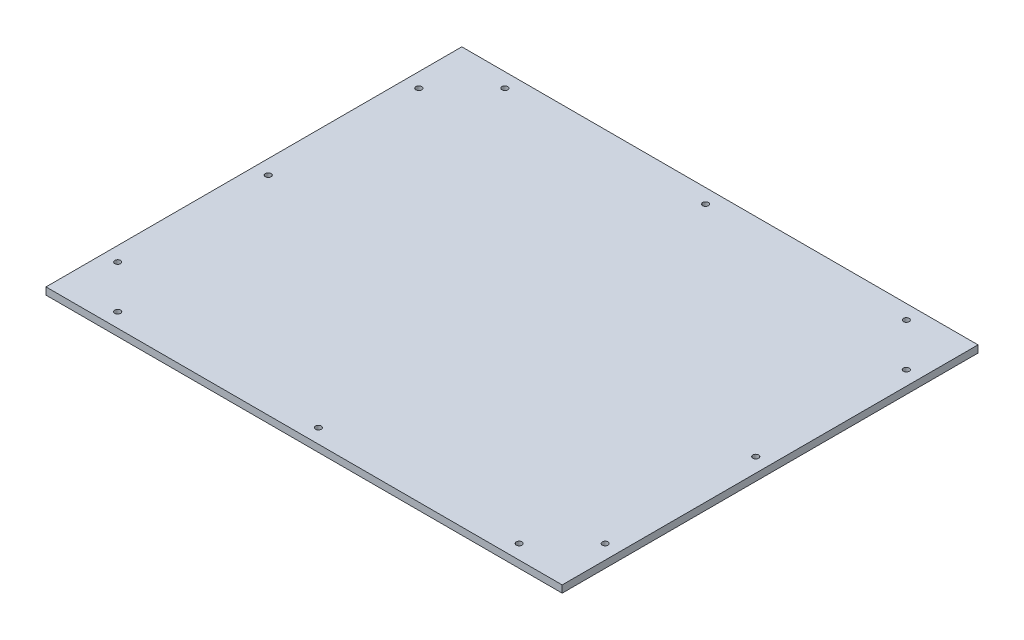
ISO-10303-21;
HEADER;
FILE_DESCRIPTION(('STEP AP214'),'2;1');
FILE_NAME('part.step','',(''),(''),'','','');
FILE_SCHEMA(('AUTOMOTIVE_DESIGN { 1 0 10303 214 1 1 1 1 }'));
ENDSEC;
DATA;
#1=APPLICATION_CONTEXT('core data for automotive mechanical design processes');
#2=APPLICATION_PROTOCOL_DEFINITION('international standard','automotive_design',2000,#1);
#3=PRODUCT_CONTEXT('',#1,'mechanical');
#4=PRODUCT('Part','Part','',(#3));
#5=PRODUCT_RELATED_PRODUCT_CATEGORY('part','',(#4));
#6=PRODUCT_DEFINITION_FORMATION('','',#4);
#7=PRODUCT_DEFINITION_CONTEXT('part definition',#1,'design');
#8=PRODUCT_DEFINITION('design','',#6,#7);
#9=PRODUCT_DEFINITION_SHAPE('','',#8);
#10=(LENGTH_UNIT() NAMED_UNIT(*) SI_UNIT(.MILLI.,.METRE.));
#11=(NAMED_UNIT(*) PLANE_ANGLE_UNIT() SI_UNIT($,.RADIAN.));
#12=(NAMED_UNIT(*) SI_UNIT($,.STERADIAN.) SOLID_ANGLE_UNIT());
#13=UNCERTAINTY_MEASURE_WITH_UNIT(LENGTH_MEASURE(1.E-05),#10,'distance_accuracy_value','');
#14=(GEOMETRIC_REPRESENTATION_CONTEXT(3) GLOBAL_UNCERTAINTY_ASSIGNED_CONTEXT((#13)) GLOBAL_UNIT_ASSIGNED_CONTEXT((#10,
#11,#12)) REPRESENTATION_CONTEXT('',''));
#15=CARTESIAN_POINT('',(0.,0.,0.));
#16=DIRECTION('',(0.,0.,1.));
#17=DIRECTION('',(1.,0.,0.));
#18=AXIS2_PLACEMENT_3D('',#15,#16,#17);
#19=CARTESIAN_POINT('',(0.,6.35,0.));
#20=DIRECTION('',(0.,-1.,0.));
#21=DIRECTION('',(0.,0.,-1.));
#22=AXIS2_PLACEMENT_3D('',#19,#20,#21);
#23=PLANE('',#22);
#24=DIRECTION('',(0.,0.,1.));
#25=VECTOR('',#24,1.);
#26=CARTESIAN_POINT('',(0.,6.35,0.));
#27=LINE('',#26,#25);
#28=CARTESIAN_POINT('',(0.,6.35,-368.3));
#29=VERTEX_POINT('',#28);
#30=CARTESIAN_POINT('',(0.,6.35,0.));
#31=VERTEX_POINT('',#30);
#32=EDGE_CURVE('E87',#29,#31,#27,.T.);
#33=ORIENTED_EDGE('',*,*,#32,.T.);
#34=DIRECTION('',(1.,0.,0.));
#35=VECTOR('',#34,1.);
#36=CARTESIAN_POINT('',(0.,6.35,0.));
#37=LINE('',#36,#35);
#38=CARTESIAN_POINT('',(457.2,6.35,0.));
#39=VERTEX_POINT('',#38);
#40=EDGE_CURVE('E82',#31,#39,#37,.T.);
#41=ORIENTED_EDGE('',*,*,#40,.T.);
#42=DIRECTION('',(0.,0.,-1.));
#43=VECTOR('',#42,1.);
#44=CARTESIAN_POINT('',(457.2,6.35,0.));
#45=LINE('',#44,#43);
#46=CARTESIAN_POINT('',(457.2,6.35,-368.3));
#47=VERTEX_POINT('',#46);
#48=EDGE_CURVE('E85',#39,#47,#45,.T.);
#49=ORIENTED_EDGE('',*,*,#48,.T.);
#50=DIRECTION('',(-1.,0.,0.));
#51=VECTOR('',#50,1.);
#52=CARTESIAN_POINT('',(0.,6.35,-368.3));
#53=LINE('',#52,#51);
#54=EDGE_CURVE('E52',#47,#29,#53,.T.);
#55=ORIENTED_EDGE('',*,*,#54,.T.);
#56=EDGE_LOOP('',(#33,#41,#49,#55));
#57=FACE_BOUND('',#56,.T.);
#58=CARTESIAN_POINT('',(50.8,6.35,-355.6));
#59=DIRECTION('',(0.,1.,0.));
#60=DIRECTION('',(0.,0.,1.));
#61=AXIS2_PLACEMENT_3D('',#58,#59,#60);
#62=CIRCLE('',#61,2.55269999999998);
#63=CARTESIAN_POINT('',(50.8,6.35,-353.0473));
#64=VERTEX_POINT('',#63);
#65=EDGE_CURVE('E102',#64,#64,#62,.T.);
#66=ORIENTED_EDGE('',*,*,#65,.F.);
#67=EDGE_LOOP('',(#66));
#68=FACE_BOUND('',#67,.T.);
#69=CARTESIAN_POINT('',(406.4,6.35,-355.6));
#70=DIRECTION('',(0.,1.,0.));
#71=DIRECTION('',(0.,0.,1.));
#72=AXIS2_PLACEMENT_3D('',#69,#70,#71);
#73=CIRCLE('',#72,2.55270000000003);
#74=CARTESIAN_POINT('',(406.4,6.35,-353.0473));
#75=VERTEX_POINT('',#74);
#76=EDGE_CURVE('E117',#75,#75,#73,.T.);
#77=ORIENTED_EDGE('',*,*,#76,.F.);
#78=EDGE_LOOP('',(#77));
#79=FACE_BOUND('',#78,.T.);
#80=CARTESIAN_POINT('',(228.6,6.35,-12.7));
#81=DIRECTION('',(0.,1.,0.));
#82=DIRECTION('',(0.,0.,1.));
#83=AXIS2_PLACEMENT_3D('',#80,#81,#82);
#84=CIRCLE('',#83,2.55269999999998);
#85=CARTESIAN_POINT('',(228.6,6.35,-10.1473));
#86=VERTEX_POINT('',#85);
#87=EDGE_CURVE('E123',#86,#86,#84,.T.);
#88=ORIENTED_EDGE('',*,*,#87,.F.);
#89=EDGE_LOOP('',(#88));
#90=FACE_BOUND('',#89,.T.);
#91=CARTESIAN_POINT('',(228.6,6.35,-355.6));
#92=DIRECTION('',(0.,1.,0.));
#93=DIRECTION('',(0.,0.,1.));
#94=AXIS2_PLACEMENT_3D('',#91,#92,#93);
#95=CIRCLE('',#94,2.55269999999998);
#96=CARTESIAN_POINT('',(228.6,6.35,-353.0473));
#97=VERTEX_POINT('',#96);
#98=EDGE_CURVE('E129',#97,#97,#95,.T.);
#99=ORIENTED_EDGE('',*,*,#98,.F.);
#100=EDGE_LOOP('',(#99));
#101=FACE_BOUND('',#100,.T.);
#102=CARTESIAN_POINT('',(12.7,6.35,-184.15));
#103=DIRECTION('',(0.,1.,0.));
#104=DIRECTION('',(0.,0.,1.));
#105=AXIS2_PLACEMENT_3D('',#102,#103,#104);
#106=CIRCLE('',#105,2.5527);
#107=CARTESIAN_POINT('',(12.7,6.35,-181.5973));
#108=VERTEX_POINT('',#107);
#109=EDGE_CURVE('E135',#108,#108,#106,.T.);
#110=ORIENTED_EDGE('',*,*,#109,.F.);
#111=EDGE_LOOP('',(#110));
#112=FACE_BOUND('',#111,.T.);
#113=CARTESIAN_POINT('',(444.5,6.35,-184.15));
#114=DIRECTION('',(0.,1.,0.));
#115=DIRECTION('',(0.,0.,1.));
#116=AXIS2_PLACEMENT_3D('',#113,#114,#115);
#117=CIRCLE('',#116,2.55270000000004);
#118=CARTESIAN_POINT('',(444.5,6.35,-181.5973));
#119=VERTEX_POINT('',#118);
#120=EDGE_CURVE('E141',#119,#119,#117,.T.);
#121=ORIENTED_EDGE('',*,*,#120,.F.);
#122=EDGE_LOOP('',(#121));
#123=FACE_BOUND('',#122,.T.);
#124=CARTESIAN_POINT('',(406.4,6.35,-12.7));
#125=DIRECTION('',(0.,1.,0.));
#126=DIRECTION('',(0.,0.,1.));
#127=AXIS2_PLACEMENT_3D('',#124,#125,#126);
#128=CIRCLE('',#127,2.55270000000004);
#129=CARTESIAN_POINT('',(406.4,6.35,-10.1472999999999));
#130=VERTEX_POINT('',#129);
#131=EDGE_CURVE('E147',#130,#130,#128,.T.);
#132=ORIENTED_EDGE('',*,*,#131,.F.);
#133=EDGE_LOOP('',(#132));
#134=FACE_BOUND('',#133,.T.);
#135=CARTESIAN_POINT('',(50.8,6.35,-12.7));
#136=DIRECTION('',(0.,1.,0.));
#137=DIRECTION('',(0.,0.,1.));
#138=AXIS2_PLACEMENT_3D('',#135,#136,#137);
#139=CIRCLE('',#138,2.5527);
#140=CARTESIAN_POINT('',(50.8,6.35,-10.1473));
#141=VERTEX_POINT('',#140);
#142=EDGE_CURVE('E153',#141,#141,#139,.T.);
#143=ORIENTED_EDGE('',*,*,#142,.F.);
#144=EDGE_LOOP('',(#143));
#145=FACE_BOUND('',#144,.T.);
#146=CARTESIAN_POINT('',(12.7,6.35,-50.8));
#147=DIRECTION('',(0.,1.,0.));
#148=DIRECTION('',(0.,0.,1.));
#149=AXIS2_PLACEMENT_3D('',#146,#147,#148);
#150=CIRCLE('',#149,2.5527);
#151=CARTESIAN_POINT('',(12.7,6.35,-48.2473));
#152=VERTEX_POINT('',#151);
#153=EDGE_CURVE('E159',#152,#152,#150,.T.);
#154=ORIENTED_EDGE('',*,*,#153,.F.);
#155=EDGE_LOOP('',(#154));
#156=FACE_BOUND('',#155,.T.);
#157=CARTESIAN_POINT('',(444.5,6.35,-50.8));
#158=DIRECTION('',(0.,1.,0.));
#159=DIRECTION('',(0.,0.,1.));
#160=AXIS2_PLACEMENT_3D('',#157,#158,#159);
#161=CIRCLE('',#160,2.55270000000004);
#162=CARTESIAN_POINT('',(444.5,6.35,-48.2473));
#163=VERTEX_POINT('',#162);
#164=EDGE_CURVE('E165',#163,#163,#161,.T.);
#165=ORIENTED_EDGE('',*,*,#164,.F.);
#166=EDGE_LOOP('',(#165));
#167=FACE_BOUND('',#166,.T.);
#168=CARTESIAN_POINT('',(444.5,6.35,-317.5));
#169=DIRECTION('',(0.,1.,0.));
#170=DIRECTION('',(0.,0.,1.));
#171=AXIS2_PLACEMENT_3D('',#168,#169,#170);
#172=CIRCLE('',#171,2.55270000000003);
#173=CARTESIAN_POINT('',(444.5,6.35,-314.9473));
#174=VERTEX_POINT('',#173);
#175=EDGE_CURVE('E171',#174,#174,#172,.T.);
#176=ORIENTED_EDGE('',*,*,#175,.F.);
#177=EDGE_LOOP('',(#176));
#178=FACE_BOUND('',#177,.T.);
#179=CARTESIAN_POINT('',(12.7,6.35,-317.5));
#180=DIRECTION('',(0.,1.,0.));
#181=DIRECTION('',(0.,0.,1.));
#182=AXIS2_PLACEMENT_3D('',#179,#180,#181);
#183=CIRCLE('',#182,2.55269999999999);
#184=CARTESIAN_POINT('',(12.7,6.35,-314.9473));
#185=VERTEX_POINT('',#184);
#186=EDGE_CURVE('E177',#185,#185,#183,.T.);
#187=ORIENTED_EDGE('',*,*,#186,.F.);
#188=EDGE_LOOP('',(#187));
#189=FACE_BOUND('',#188,.T.);
#190=ADVANCED_FACE('F35',(#57,#68,#79,#90,#101,#112,#123,#134,#145,#156,#167,#178,#189),#23,.F.);
#191=CARTESIAN_POINT('',(0.,0.,0.));
#192=DIRECTION('',(0.,-1.,0.));
#193=DIRECTION('',(0.,0.,-1.));
#194=AXIS2_PLACEMENT_3D('',#191,#192,#193);
#195=PLANE('',#194);
#196=CARTESIAN_POINT('',(444.5,0.,-317.5));
#197=DIRECTION('',(0.,1.,0.));
#198=DIRECTION('',(0.,0.,1.));
#199=AXIS2_PLACEMENT_3D('',#196,#197,#198);
#200=CIRCLE('',#199,2.55270000000003);
#201=CARTESIAN_POINT('',(444.5,0.,-314.9473));
#202=VERTEX_POINT('',#201);
#203=EDGE_CURVE('E174',#202,#202,#200,.T.);
#204=ORIENTED_EDGE('',*,*,#203,.T.);
#205=EDGE_LOOP('',(#204));
#206=FACE_BOUND('',#205,.T.);
#207=CARTESIAN_POINT('',(12.7,0.,-50.8));
#208=DIRECTION('',(0.,1.,0.));
#209=DIRECTION('',(0.,0.,1.));
#210=AXIS2_PLACEMENT_3D('',#207,#208,#209);
#211=CIRCLE('',#210,2.5527);
#212=CARTESIAN_POINT('',(12.7,0.,-48.2473));
#213=VERTEX_POINT('',#212);
#214=EDGE_CURVE('E162',#213,#213,#211,.T.);
#215=ORIENTED_EDGE('',*,*,#214,.T.);
#216=EDGE_LOOP('',(#215));
#217=FACE_BOUND('',#216,.T.);
#218=CARTESIAN_POINT('',(406.4,0.,-12.7));
#219=DIRECTION('',(0.,1.,0.));
#220=DIRECTION('',(0.,0.,1.));
#221=AXIS2_PLACEMENT_3D('',#218,#219,#220);
#222=CIRCLE('',#221,2.55270000000004);
#223=CARTESIAN_POINT('',(406.4,0.,-10.1472999999999));
#224=VERTEX_POINT('',#223);
#225=EDGE_CURVE('E150',#224,#224,#222,.T.);
#226=ORIENTED_EDGE('',*,*,#225,.T.);
#227=EDGE_LOOP('',(#226));
#228=FACE_BOUND('',#227,.T.);
#229=CARTESIAN_POINT('',(12.7,0.,-184.15));
#230=DIRECTION('',(0.,1.,0.));
#231=DIRECTION('',(0.,0.,1.));
#232=AXIS2_PLACEMENT_3D('',#229,#230,#231);
#233=CIRCLE('',#232,2.5527);
#234=CARTESIAN_POINT('',(12.7,0.,-181.5973));
#235=VERTEX_POINT('',#234);
#236=EDGE_CURVE('E138',#235,#235,#233,.T.);
#237=ORIENTED_EDGE('',*,*,#236,.T.);
#238=EDGE_LOOP('',(#237));
#239=FACE_BOUND('',#238,.T.);
#240=CARTESIAN_POINT('',(228.6,0.,-12.7));
#241=DIRECTION('',(0.,1.,0.));
#242=DIRECTION('',(0.,0.,1.));
#243=AXIS2_PLACEMENT_3D('',#240,#241,#242);
#244=CIRCLE('',#243,2.55269999999998);
#245=CARTESIAN_POINT('',(228.6,0.,-10.1473));
#246=VERTEX_POINT('',#245);
#247=EDGE_CURVE('E126',#246,#246,#244,.T.);
#248=ORIENTED_EDGE('',*,*,#247,.T.);
#249=EDGE_LOOP('',(#248));
#250=FACE_BOUND('',#249,.T.);
#251=CARTESIAN_POINT('',(50.8,0.,-355.6));
#252=DIRECTION('',(0.,1.,0.));
#253=DIRECTION('',(0.,0.,1.));
#254=AXIS2_PLACEMENT_3D('',#251,#252,#253);
#255=CIRCLE('',#254,2.55269999999998);
#256=CARTESIAN_POINT('',(50.8,0.,-353.0473));
#257=VERTEX_POINT('',#256);
#258=EDGE_CURVE('E114',#257,#257,#255,.T.);
#259=ORIENTED_EDGE('',*,*,#258,.T.);
#260=EDGE_LOOP('',(#259));
#261=FACE_BOUND('',#260,.T.);
#262=DIRECTION('',(0.,0.,1.));
#263=VECTOR('',#262,1.);
#264=CARTESIAN_POINT('',(0.,0.,0.));
#265=LINE('',#264,#263);
#266=CARTESIAN_POINT('',(0.,0.,-368.3));
#267=VERTEX_POINT('',#266);
#268=CARTESIAN_POINT('',(0.,0.,0.));
#269=VERTEX_POINT('',#268);
#270=EDGE_CURVE('E99',#267,#269,#265,.T.);
#271=ORIENTED_EDGE('',*,*,#270,.F.);
#272=DIRECTION('',(-1.,0.,0.));
#273=VECTOR('',#272,1.);
#274=CARTESIAN_POINT('',(0.,0.,-368.3));
#275=LINE('',#274,#273);
#276=CARTESIAN_POINT('',(457.2,0.,-368.3));
#277=VERTEX_POINT('',#276);
#278=EDGE_CURVE('E75',#277,#267,#275,.T.);
#279=ORIENTED_EDGE('',*,*,#278,.F.);
#280=DIRECTION('',(0.,0.,-1.));
#281=VECTOR('',#280,1.);
#282=CARTESIAN_POINT('',(457.2,0.,0.));
#283=LINE('',#282,#281);
#284=CARTESIAN_POINT('',(457.2,0.,0.));
#285=VERTEX_POINT('',#284);
#286=EDGE_CURVE('E69',#285,#277,#283,.T.);
#287=ORIENTED_EDGE('',*,*,#286,.F.);
#288=DIRECTION('',(1.,0.,0.));
#289=VECTOR('',#288,1.);
#290=CARTESIAN_POINT('',(0.,0.,0.));
#291=LINE('',#290,#289);
#292=EDGE_CURVE('E91',#269,#285,#291,.T.);
#293=ORIENTED_EDGE('',*,*,#292,.F.);
#294=EDGE_LOOP('',(#271,#279,#287,#293));
#295=FACE_BOUND('',#294,.T.);
#296=CARTESIAN_POINT('',(406.4,0.,-355.6));
#297=DIRECTION('',(0.,1.,0.));
#298=DIRECTION('',(0.,0.,1.));
#299=AXIS2_PLACEMENT_3D('',#296,#297,#298);
#300=CIRCLE('',#299,2.55270000000003);
#301=CARTESIAN_POINT('',(406.4,0.,-353.0473));
#302=VERTEX_POINT('',#301);
#303=EDGE_CURVE('E120',#302,#302,#300,.T.);
#304=ORIENTED_EDGE('',*,*,#303,.T.);
#305=EDGE_LOOP('',(#304));
#306=FACE_BOUND('',#305,.T.);
#307=CARTESIAN_POINT('',(228.6,0.,-355.6));
#308=DIRECTION('',(0.,1.,0.));
#309=DIRECTION('',(0.,0.,1.));
#310=AXIS2_PLACEMENT_3D('',#307,#308,#309);
#311=CIRCLE('',#310,2.55269999999998);
#312=CARTESIAN_POINT('',(228.6,0.,-353.0473));
#313=VERTEX_POINT('',#312);
#314=EDGE_CURVE('E132',#313,#313,#311,.T.);
#315=ORIENTED_EDGE('',*,*,#314,.T.);
#316=EDGE_LOOP('',(#315));
#317=FACE_BOUND('',#316,.T.);
#318=CARTESIAN_POINT('',(444.5,0.,-184.15));
#319=DIRECTION('',(0.,1.,0.));
#320=DIRECTION('',(0.,0.,1.));
#321=AXIS2_PLACEMENT_3D('',#318,#319,#320);
#322=CIRCLE('',#321,2.55270000000004);
#323=CARTESIAN_POINT('',(444.5,0.,-181.5973));
#324=VERTEX_POINT('',#323);
#325=EDGE_CURVE('E144',#324,#324,#322,.T.);
#326=ORIENTED_EDGE('',*,*,#325,.T.);
#327=EDGE_LOOP('',(#326));
#328=FACE_BOUND('',#327,.T.);
#329=CARTESIAN_POINT('',(50.8,0.,-12.7));
#330=DIRECTION('',(0.,1.,0.));
#331=DIRECTION('',(0.,0.,1.));
#332=AXIS2_PLACEMENT_3D('',#329,#330,#331);
#333=CIRCLE('',#332,2.5527);
#334=CARTESIAN_POINT('',(50.8,0.,-10.1473));
#335=VERTEX_POINT('',#334);
#336=EDGE_CURVE('E156',#335,#335,#333,.T.);
#337=ORIENTED_EDGE('',*,*,#336,.T.);
#338=EDGE_LOOP('',(#337));
#339=FACE_BOUND('',#338,.T.);
#340=CARTESIAN_POINT('',(444.5,0.,-50.8));
#341=DIRECTION('',(0.,1.,0.));
#342=DIRECTION('',(0.,0.,1.));
#343=AXIS2_PLACEMENT_3D('',#340,#341,#342);
#344=CIRCLE('',#343,2.55270000000004);
#345=CARTESIAN_POINT('',(444.5,0.,-48.2473));
#346=VERTEX_POINT('',#345);
#347=EDGE_CURVE('E168',#346,#346,#344,.T.);
#348=ORIENTED_EDGE('',*,*,#347,.T.);
#349=EDGE_LOOP('',(#348));
#350=FACE_BOUND('',#349,.T.);
#351=CARTESIAN_POINT('',(12.7,0.,-317.5));
#352=DIRECTION('',(0.,1.,0.));
#353=DIRECTION('',(0.,0.,1.));
#354=AXIS2_PLACEMENT_3D('',#351,#352,#353);
#355=CIRCLE('',#354,2.55269999999999);
#356=CARTESIAN_POINT('',(12.7,0.,-314.9473));
#357=VERTEX_POINT('',#356);
#358=EDGE_CURVE('E180',#357,#357,#355,.T.);
#359=ORIENTED_EDGE('',*,*,#358,.T.);
#360=EDGE_LOOP('',(#359));
#361=FACE_BOUND('',#360,.T.);
#362=ADVANCED_FACE('F110',(#206,#217,#228,#239,#250,#261,#295,#306,#317,#328,#339,#350,#361),
#195,.T.);
#363=CARTESIAN_POINT('',(0.,6.35,0.));
#364=DIRECTION('',(1.,0.,0.));
#365=DIRECTION('',(0.,0.,-1.));
#366=AXIS2_PLACEMENT_3D('',#363,#364,#365);
#367=PLANE('',#366);
#368=ORIENTED_EDGE('',*,*,#270,.T.);
#369=DIRECTION('',(0.,-1.,0.));
#370=VECTOR('',#369,1.);
#371=CARTESIAN_POINT('',(0.,6.35,0.));
#372=LINE('',#371,#370);
#373=EDGE_CURVE('E11',#31,#269,#372,.T.);
#374=ORIENTED_EDGE('',*,*,#373,.F.);
#375=ORIENTED_EDGE('',*,*,#32,.F.);
#376=DIRECTION('',(0.,-1.,0.));
#377=VECTOR('',#376,1.);
#378=CARTESIAN_POINT('',(0.,6.35,-368.3));
#379=LINE('',#378,#377);
#380=EDGE_CURVE('E95',#29,#267,#379,.T.);
#381=ORIENTED_EDGE('',*,*,#380,.T.);
#382=EDGE_LOOP('',(#368,#374,#375,#381));
#383=FACE_BOUND('',#382,.T.);
#384=ADVANCED_FACE('F37',(#383),#367,.F.);
#385=CARTESIAN_POINT('',(0.,6.35,0.));
#386=DIRECTION('',(0.,0.,-1.));
#387=DIRECTION('',(-1.,0.,0.));
#388=AXIS2_PLACEMENT_3D('',#385,#386,#387);
#389=PLANE('',#388);
#390=ORIENTED_EDGE('',*,*,#292,.T.);
#391=DIRECTION('',(0.,-1.,0.));
#392=VECTOR('',#391,1.);
#393=CARTESIAN_POINT('',(457.2,6.35,0.));
#394=LINE('',#393,#392);
#395=EDGE_CURVE('E44',#39,#285,#394,.T.);
#396=ORIENTED_EDGE('',*,*,#395,.F.);
#397=ORIENTED_EDGE('',*,*,#40,.F.);
#398=ORIENTED_EDGE('',*,*,#373,.T.);
#399=EDGE_LOOP('',(#390,#396,#397,#398));
#400=FACE_BOUND('',#399,.T.);
#401=ADVANCED_FACE('F90',(#400),#389,.F.);
#402=CARTESIAN_POINT('',(457.2,6.35,0.));
#403=DIRECTION('',(-1.,0.,0.));
#404=DIRECTION('',(0.,0.,1.));
#405=AXIS2_PLACEMENT_3D('',#402,#403,#404);
#406=PLANE('',#405);
#407=ORIENTED_EDGE('',*,*,#286,.T.);
#408=DIRECTION('',(0.,-1.,0.));
#409=VECTOR('',#408,1.);
#410=CARTESIAN_POINT('',(457.2,6.35,-368.3));
#411=LINE('',#410,#409);
#412=EDGE_CURVE('E92',#47,#277,#411,.T.);
#413=ORIENTED_EDGE('',*,*,#412,.F.);
#414=ORIENTED_EDGE('',*,*,#48,.F.);
#415=ORIENTED_EDGE('',*,*,#395,.T.);
#416=EDGE_LOOP('',(#407,#413,#414,#415));
#417=FACE_BOUND('',#416,.T.);
#418=ADVANCED_FACE('F93',(#417),#406,.F.);
#419=CARTESIAN_POINT('',(0.,6.35,-368.3));
#420=DIRECTION('',(0.,0.,1.));
#421=DIRECTION('',(1.,0.,0.));
#422=AXIS2_PLACEMENT_3D('',#419,#420,#421);
#423=PLANE('',#422);
#424=ORIENTED_EDGE('',*,*,#278,.T.);
#425=ORIENTED_EDGE('',*,*,#380,.F.);
#426=ORIENTED_EDGE('',*,*,#54,.F.);
#427=ORIENTED_EDGE('',*,*,#412,.T.);
#428=EDGE_LOOP('',(#424,#425,#426,#427));
#429=FACE_BOUND('',#428,.T.);
#430=ADVANCED_FACE('F107',(#429),#423,.F.);
#431=CARTESIAN_POINT('',(50.8,6.35,-355.6));
#432=DIRECTION('',(0.,-1.,0.));
#433=DIRECTION('',(0.,0.,-1.));
#434=AXIS2_PLACEMENT_3D('',#431,#432,#433);
#435=CYLINDRICAL_SURFACE('',#434,2.55269999999998);
#436=ORIENTED_EDGE('',*,*,#65,.T.);
#437=EDGE_LOOP('',(#436));
#438=FACE_BOUND('',#437,.T.);
#439=ORIENTED_EDGE('',*,*,#258,.F.);
#440=EDGE_LOOP('',(#439));
#441=FACE_BOUND('',#440,.T.);
#442=ADVANCED_FACE('F197',(#438,#441),#435,.F.);
#443=CARTESIAN_POINT('',(406.4,6.35,-355.6));
#444=DIRECTION('',(0.,-1.,0.));
#445=DIRECTION('',(0.,0.,-1.));
#446=AXIS2_PLACEMENT_3D('',#443,#444,#445);
#447=CYLINDRICAL_SURFACE('',#446,2.55270000000003);
#448=ORIENTED_EDGE('',*,*,#76,.T.);
#449=EDGE_LOOP('',(#448));
#450=FACE_BOUND('',#449,.T.);
#451=ORIENTED_EDGE('',*,*,#303,.F.);
#452=EDGE_LOOP('',(#451));
#453=FACE_BOUND('',#452,.T.);
#454=ADVANCED_FACE('F243',(#450,#453),#447,.F.);
#455=CARTESIAN_POINT('',(228.6,6.35,-12.7));
#456=DIRECTION('',(0.,-1.,0.));
#457=DIRECTION('',(0.,0.,-1.));
#458=AXIS2_PLACEMENT_3D('',#455,#456,#457);
#459=CYLINDRICAL_SURFACE('',#458,2.55269999999998);
#460=ORIENTED_EDGE('',*,*,#87,.T.);
#461=EDGE_LOOP('',(#460));
#462=FACE_BOUND('',#461,.T.);
#463=ORIENTED_EDGE('',*,*,#247,.F.);
#464=EDGE_LOOP('',(#463));
#465=FACE_BOUND('',#464,.T.);
#466=ADVANCED_FACE('F251',(#462,#465),#459,.F.);
#467=CARTESIAN_POINT('',(228.6,6.35,-355.6));
#468=DIRECTION('',(0.,-1.,0.));
#469=DIRECTION('',(0.,0.,-1.));
#470=AXIS2_PLACEMENT_3D('',#467,#468,#469);
#471=CYLINDRICAL_SURFACE('',#470,2.55269999999998);
#472=ORIENTED_EDGE('',*,*,#98,.T.);
#473=EDGE_LOOP('',(#472));
#474=FACE_BOUND('',#473,.T.);
#475=ORIENTED_EDGE('',*,*,#314,.F.);
#476=EDGE_LOOP('',(#475));
#477=FACE_BOUND('',#476,.T.);
#478=ADVANCED_FACE('F259',(#474,#477),#471,.F.);
#479=CARTESIAN_POINT('',(12.7,6.35,-184.15));
#480=DIRECTION('',(0.,-1.,0.));
#481=DIRECTION('',(0.,0.,-1.));
#482=AXIS2_PLACEMENT_3D('',#479,#480,#481);
#483=CYLINDRICAL_SURFACE('',#482,2.5527);
#484=ORIENTED_EDGE('',*,*,#109,.T.);
#485=EDGE_LOOP('',(#484));
#486=FACE_BOUND('',#485,.T.);
#487=ORIENTED_EDGE('',*,*,#236,.F.);
#488=EDGE_LOOP('',(#487));
#489=FACE_BOUND('',#488,.T.);
#490=ADVANCED_FACE('F268',(#486,#489),#483,.F.);
#491=CARTESIAN_POINT('',(444.5,6.35,-184.15));
#492=DIRECTION('',(0.,-1.,0.));
#493=DIRECTION('',(0.,0.,-1.));
#494=AXIS2_PLACEMENT_3D('',#491,#492,#493);
#495=CYLINDRICAL_SURFACE('',#494,2.55270000000004);
#496=ORIENTED_EDGE('',*,*,#120,.T.);
#497=EDGE_LOOP('',(#496));
#498=FACE_BOUND('',#497,.T.);
#499=ORIENTED_EDGE('',*,*,#325,.F.);
#500=EDGE_LOOP('',(#499));
#501=FACE_BOUND('',#500,.T.);
#502=ADVANCED_FACE('F277',(#498,#501),#495,.F.);
#503=CARTESIAN_POINT('',(406.4,6.35,-12.7));
#504=DIRECTION('',(0.,-1.,0.));
#505=DIRECTION('',(0.,0.,-1.));
#506=AXIS2_PLACEMENT_3D('',#503,#504,#505);
#507=CYLINDRICAL_SURFACE('',#506,2.55270000000004);
#508=ORIENTED_EDGE('',*,*,#131,.T.);
#509=EDGE_LOOP('',(#508));
#510=FACE_BOUND('',#509,.T.);
#511=ORIENTED_EDGE('',*,*,#225,.F.);
#512=EDGE_LOOP('',(#511));
#513=FACE_BOUND('',#512,.T.);
#514=ADVANCED_FACE('F286',(#510,#513),#507,.F.);
#515=CARTESIAN_POINT('',(50.8,6.35,-12.7));
#516=DIRECTION('',(0.,-1.,0.));
#517=DIRECTION('',(0.,0.,-1.));
#518=AXIS2_PLACEMENT_3D('',#515,#516,#517);
#519=CYLINDRICAL_SURFACE('',#518,2.5527);
#520=ORIENTED_EDGE('',*,*,#142,.T.);
#521=EDGE_LOOP('',(#520));
#522=FACE_BOUND('',#521,.T.);
#523=ORIENTED_EDGE('',*,*,#336,.F.);
#524=EDGE_LOOP('',(#523));
#525=FACE_BOUND('',#524,.T.);
#526=ADVANCED_FACE('F295',(#522,#525),#519,.F.);
#527=CARTESIAN_POINT('',(12.7,6.35,-50.8));
#528=DIRECTION('',(0.,-1.,0.));
#529=DIRECTION('',(0.,0.,-1.));
#530=AXIS2_PLACEMENT_3D('',#527,#528,#529);
#531=CYLINDRICAL_SURFACE('',#530,2.5527);
#532=ORIENTED_EDGE('',*,*,#153,.T.);
#533=EDGE_LOOP('',(#532));
#534=FACE_BOUND('',#533,.T.);
#535=ORIENTED_EDGE('',*,*,#214,.F.);
#536=EDGE_LOOP('',(#535));
#537=FACE_BOUND('',#536,.T.);
#538=ADVANCED_FACE('F304',(#534,#537),#531,.F.);
#539=CARTESIAN_POINT('',(444.5,6.35,-50.8));
#540=DIRECTION('',(0.,-1.,0.));
#541=DIRECTION('',(0.,0.,-1.));
#542=AXIS2_PLACEMENT_3D('',#539,#540,#541);
#543=CYLINDRICAL_SURFACE('',#542,2.55270000000004);
#544=ORIENTED_EDGE('',*,*,#164,.T.);
#545=EDGE_LOOP('',(#544));
#546=FACE_BOUND('',#545,.T.);
#547=ORIENTED_EDGE('',*,*,#347,.F.);
#548=EDGE_LOOP('',(#547));
#549=FACE_BOUND('',#548,.T.);
#550=ADVANCED_FACE('F313',(#546,#549),#543,.F.);
#551=CARTESIAN_POINT('',(444.5,6.35,-317.5));
#552=DIRECTION('',(0.,-1.,0.));
#553=DIRECTION('',(0.,0.,-1.));
#554=AXIS2_PLACEMENT_3D('',#551,#552,#553);
#555=CYLINDRICAL_SURFACE('',#554,2.55270000000003);
#556=ORIENTED_EDGE('',*,*,#175,.T.);
#557=EDGE_LOOP('',(#556));
#558=FACE_BOUND('',#557,.T.);
#559=ORIENTED_EDGE('',*,*,#203,.F.);
#560=EDGE_LOOP('',(#559));
#561=FACE_BOUND('',#560,.T.);
#562=ADVANCED_FACE('F322',(#558,#561),#555,.F.);
#563=CARTESIAN_POINT('',(12.7,6.35,-317.5));
#564=DIRECTION('',(0.,-1.,0.));
#565=DIRECTION('',(0.,0.,-1.));
#566=AXIS2_PLACEMENT_3D('',#563,#564,#565);
#567=CYLINDRICAL_SURFACE('',#566,2.55269999999999);
#568=ORIENTED_EDGE('',*,*,#186,.T.);
#569=EDGE_LOOP('',(#568));
#570=FACE_BOUND('',#569,.T.);
#571=ORIENTED_EDGE('',*,*,#358,.F.);
#572=EDGE_LOOP('',(#571));
#573=FACE_BOUND('',#572,.T.);
#574=ADVANCED_FACE('F186',(#570,#573),#567,.F.);
#575=CLOSED_SHELL('',(#190,#362,#384,#401,#418,#430,#442,#454,#466,#478,#490,#502,#514,#526,
#538,#550,#562,#574));
#576=MANIFOLD_SOLID_BREP('B2',#575);
#577=ADVANCED_BREP_SHAPE_REPRESENTATION('',(#18,#576),#14);
#578=SHAPE_DEFINITION_REPRESENTATION(#9,#577);
ENDSEC;
END-ISO-10303-21;
